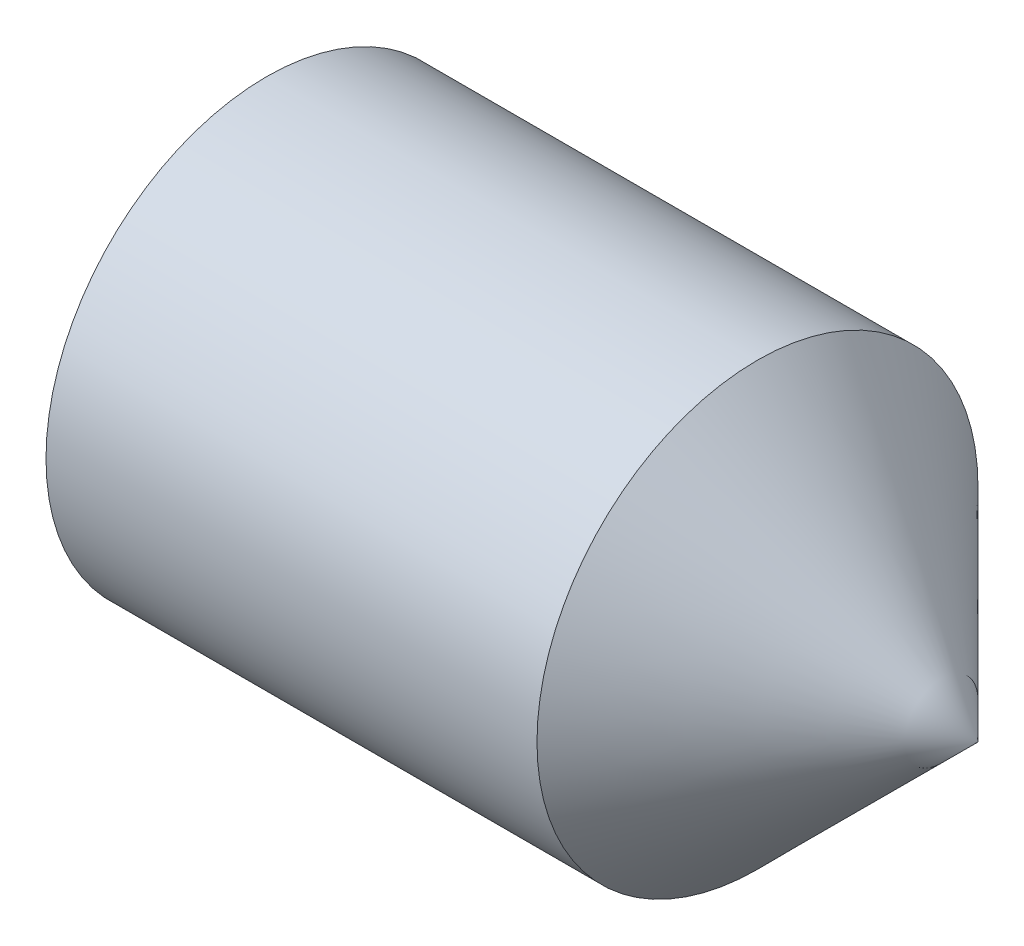
ISO-10303-21;
HEADER;
FILE_DESCRIPTION(('STEP AP214'),'2;1');
FILE_NAME('part.step','',(''),(''),'','','');
FILE_SCHEMA(('AUTOMOTIVE_DESIGN { 1 0 10303 214 1 1 1 1 }'));
ENDSEC;
DATA;
#1=APPLICATION_CONTEXT('core data for automotive mechanical design processes');
#2=APPLICATION_PROTOCOL_DEFINITION('international standard','automotive_design',2000,#1);
#3=PRODUCT_CONTEXT('',#1,'mechanical');
#4=PRODUCT('Part','Part','',(#3));
#5=PRODUCT_RELATED_PRODUCT_CATEGORY('part','',(#4));
#6=PRODUCT_DEFINITION_FORMATION('','',#4);
#7=PRODUCT_DEFINITION_CONTEXT('part definition',#1,'design');
#8=PRODUCT_DEFINITION('design','',#6,#7);
#9=PRODUCT_DEFINITION_SHAPE('','',#8);
#10=(LENGTH_UNIT() NAMED_UNIT(*) SI_UNIT(.MILLI.,.METRE.));
#11=(NAMED_UNIT(*) PLANE_ANGLE_UNIT() SI_UNIT($,.RADIAN.));
#12=(NAMED_UNIT(*) SI_UNIT($,.STERADIAN.) SOLID_ANGLE_UNIT());
#13=UNCERTAINTY_MEASURE_WITH_UNIT(LENGTH_MEASURE(1.E-05),#10,'distance_accuracy_value','');
#14=(GEOMETRIC_REPRESENTATION_CONTEXT(3) GLOBAL_UNCERTAINTY_ASSIGNED_CONTEXT((#13)) GLOBAL_UNIT_ASSIGNED_CONTEXT((#10,
#11,#12)) REPRESENTATION_CONTEXT('',''));
#15=CARTESIAN_POINT('',(0.,0.,0.));
#16=DIRECTION('',(0.,0.,1.));
#17=DIRECTION('',(1.,0.,0.));
#18=AXIS2_PLACEMENT_3D('',#15,#16,#17);
#19=CARTESIAN_POINT('',(0.,0.,0.));
#20=DIRECTION('',(-1.,0.,0.));
#21=DIRECTION('',(0.,0.,1.));
#22=AXIS2_PLACEMENT_3D('',#19,#20,#21);
#23=PLANE('',#22);
#24=CARTESIAN_POINT('',(0.,0.,0.));
#25=DIRECTION('',(-1.,0.,0.));
#26=DIRECTION('',(0.,0.,1.));
#27=AXIS2_PLACEMENT_3D('',#24,#25,#26);
#28=CIRCLE('',#27,2.4455);
#29=CARTESIAN_POINT('',(0.,0.,-2.4455));
#30=VERTEX_POINT('',#29);
#31=EDGE_CURVE('E13',#30,#30,#28,.T.);
#32=ORIENTED_EDGE('',*,*,#31,.T.);
#33=EDGE_LOOP('',(#32));
#34=FACE_BOUND('',#33,.T.);
#35=DIRECTION('',(0.,0.,-1.));
#36=VECTOR('',#35,1.);
#37=CARTESIAN_POINT('',(0.,1.50000000000003,0.866025403784415));
#38=LINE('',#37,#36);
#39=CARTESIAN_POINT('',(0.,1.50000000000003,0.866025403784415));
#40=VERTEX_POINT('',#39);
#41=CARTESIAN_POINT('',(0.,1.50000000000006,-0.866025403784471));
#42=VERTEX_POINT('',#41);
#43=EDGE_CURVE('E109',#40,#42,#38,.T.);
#44=ORIENTED_EDGE('',*,*,#43,.F.);
#45=DIRECTION('',(0.,-0.866025403784439,0.5));
#46=VECTOR('',#45,1.);
#47=CARTESIAN_POINT('',(0.,1.50000000000003,0.866025403784415));
#48=LINE('',#47,#46);
#49=CARTESIAN_POINT('',(0.,0.,1.73205080756883));
#50=VERTEX_POINT('',#49);
#51=EDGE_CURVE('E62',#40,#50,#48,.T.);
#52=ORIENTED_EDGE('',*,*,#51,.T.);
#53=DIRECTION('',(0.,0.866025403784438,0.5));
#54=VECTOR('',#53,1.);
#55=CARTESIAN_POINT('',(0.,-1.49999999999999,0.866025403784415));
#56=LINE('',#55,#54);
#57=CARTESIAN_POINT('',(0.,-1.49999999999999,0.866025403784415));
#58=VERTEX_POINT('',#57);
#59=EDGE_CURVE('E115',#58,#50,#56,.T.);
#60=ORIENTED_EDGE('',*,*,#59,.F.);
#61=DIRECTION('',(0.,0.,-1.));
#62=VECTOR('',#61,1.);
#63=CARTESIAN_POINT('',(0.,-1.49999999999999,0.866025403784415));
#64=LINE('',#63,#62);
#65=CARTESIAN_POINT('',(0.,-1.49999999999999,-0.866025403784471));
#66=VERTEX_POINT('',#65);
#67=EDGE_CURVE('E135',#58,#66,#64,.T.);
#68=ORIENTED_EDGE('',*,*,#67,.T.);
#69=DIRECTION('',(0.,0.866025403784438,-0.500000000000001));
#70=VECTOR('',#69,1.);
#71=CARTESIAN_POINT('',(0.,-1.49999999999999,-0.866025403784471));
#72=LINE('',#71,#70);
#73=CARTESIAN_POINT('',(0.,0.,-1.73205080756891));
#74=VERTEX_POINT('',#73);
#75=EDGE_CURVE('E138',#66,#74,#72,.T.);
#76=ORIENTED_EDGE('',*,*,#75,.T.);
#77=DIRECTION('',(0.,-0.866025403784438,-0.5));
#78=VECTOR('',#77,1.);
#79=CARTESIAN_POINT('',(0.,1.50000000000006,-0.866025403784471));
#80=LINE('',#79,#78);
#81=EDGE_CURVE('E141',#42,#74,#80,.T.);
#82=ORIENTED_EDGE('',*,*,#81,.F.);
#83=EDGE_LOOP('',(#44,#52,#60,#68,#76,#82));
#84=FACE_BOUND('',#83,.T.);
#85=ADVANCED_FACE('F48',(#34,#84),#23,.T.);
#86=CARTESIAN_POINT('',(0.,0.,0.));
#87=DIRECTION('',(1.,0.,0.));
#88=DIRECTION('',(0.,0.,-1.));
#89=AXIS2_PLACEMENT_3D('',#86,#87,#88);
#90=CONICAL_SURFACE('',#89,2.4455,1.0471975511966);
#91=CARTESIAN_POINT('',(0.320140724265616,0.,0.));
#92=DIRECTION('',(-1.,0.,0.));
#93=DIRECTION('',(0.,0.,1.));
#94=AXIS2_PLACEMENT_3D('',#91,#92,#93);
#95=CIRCLE('',#94,3.);
#96=CARTESIAN_POINT('',(0.320140724265616,0.,-2.99999999999995));
#97=VERTEX_POINT('',#96);
#98=EDGE_CURVE('E55',#97,#97,#95,.T.);
#99=CARTESIAN_POINT('',(0.320140724265616,0.,-2.99999999999995));
#100=CARTESIAN_POINT('',(0.316805925054516,0.,-2.99422395833328));
#101=CARTESIAN_POINT('',(0.313471125843416,0.,-2.98844791666662));
#102=CARTESIAN_POINT('',(0.306801527421215,0.,-2.97689583333328));
#103=CARTESIAN_POINT('',(0.303466728210115,0.,-2.97111979166662));
#104=CARTESIAN_POINT('',(0.296797129787915,0.,-2.95956770833329));
#105=CARTESIAN_POINT('',(0.293462330576815,0.,-2.95379166666662));
#106=CARTESIAN_POINT('',(0.286792732154614,0.,-2.94223958333329));
#107=CARTESIAN_POINT('',(0.283457932943514,0.,-2.93646354166662));
#108=CARTESIAN_POINT('',(0.276788334521314,0.,-2.92491145833329));
#109=CARTESIAN_POINT('',(0.273453535310214,0.,-2.91913541666662));
#110=CARTESIAN_POINT('',(0.266783936888013,0.,-2.90758333333329));
#111=CARTESIAN_POINT('',(0.263449137676913,0.,-2.90180729166662));
#112=CARTESIAN_POINT('',(0.256779539254713,0.,-2.89025520833329));
#113=CARTESIAN_POINT('',(0.253444740043613,0.,-2.88447916666663));
#114=CARTESIAN_POINT('',(0.246775141621412,0.,-2.87292708333329));
#115=CARTESIAN_POINT('',(0.243440342410312,0.,-2.86715104166663));
#116=CARTESIAN_POINT('',(0.236770743988112,0.,-2.8555989583333));
#117=CARTESIAN_POINT('',(0.233435944777012,0.,-2.84982291666663));
#118=CARTESIAN_POINT('',(0.226766346354811,0.,-2.8382708333333));
#119=CARTESIAN_POINT('',(0.223431547143711,0.,-2.83249479166663));
#120=CARTESIAN_POINT('',(0.216761948721511,0.,-2.8209427083333));
#121=CARTESIAN_POINT('',(0.213427149510411,0.,-2.81516666666663));
#122=CARTESIAN_POINT('',(0.20675755108821,0.,-2.8036145833333));
#123=CARTESIAN_POINT('',(0.20342275187711,0.,-2.79783854166663));
#124=CARTESIAN_POINT('',(0.19675315345491,0.,-2.7862864583333));
#125=CARTESIAN_POINT('',(0.19341835424381,0.,-2.78051041666664));
#126=CARTESIAN_POINT('',(0.186748755821609,0.,-2.7689583333333));
#127=CARTESIAN_POINT('',(0.183413956610509,0.,-2.76318229166664));
#128=CARTESIAN_POINT('',(0.176744358188309,0.,-2.7516302083333));
#129=CARTESIAN_POINT('',(0.173409558977209,0.,-2.74585416666664));
#130=CARTESIAN_POINT('',(0.166739960555008,0.,-2.73430208333331));
#131=CARTESIAN_POINT('',(0.163405161343908,0.,-2.72852604166664));
#132=CARTESIAN_POINT('',(0.156735562921708,0.,-2.71697395833331));
#133=CARTESIAN_POINT('',(0.153400763710608,0.,-2.71119791666664));
#134=CARTESIAN_POINT('',(0.146731165288407,0.,-2.69964583333331));
#135=CARTESIAN_POINT('',(0.143396366077307,0.,-2.69386979166664));
#136=CARTESIAN_POINT('',(0.136726767655107,0.,-2.68231770833331));
#137=CARTESIAN_POINT('',(0.133391968444007,0.,-2.67654166666664));
#138=CARTESIAN_POINT('',(0.126722370021806,0.,-2.66498958333331));
#139=CARTESIAN_POINT('',(0.123387570810706,0.,-2.65921354166665));
#140=CARTESIAN_POINT('',(0.116717972388506,0.,-2.64766145833331));
#141=CARTESIAN_POINT('',(0.113383173177406,0.,-2.64188541666665));
#142=CARTESIAN_POINT('',(0.106713574755205,0.,-2.63033333333332));
#143=CARTESIAN_POINT('',(0.103378775544105,0.,-2.62455729166665));
#144=CARTESIAN_POINT('',(0.0967091771219047,0.,-2.61300520833332));
#145=CARTESIAN_POINT('',(0.0933743779108045,0.,-2.60722916666665));
#146=CARTESIAN_POINT('',(0.0867047794886042,0.,-2.59567708333332));
#147=CARTESIAN_POINT('',(0.0833699802775041,0.,-2.58990104166665));
#148=CARTESIAN_POINT('',(0.0767003818553037,0.,-2.57834895833332));
#149=CARTESIAN_POINT('',(0.0733655826442035,0.,-2.57257291666665));
#150=CARTESIAN_POINT('',(0.0666959842220032,0.,-2.56102083333332));
#151=CARTESIAN_POINT('',(0.0633611850109031,0.,-2.55524479166666));
#152=CARTESIAN_POINT('',(0.0566915865887027,0.,-2.54369270833332));
#153=CARTESIAN_POINT('',(0.0533567873776026,0.,-2.53791666666666));
#154=CARTESIAN_POINT('',(0.0466871889554022,0.,-2.52636458333333));
#155=CARTESIAN_POINT('',(0.043352389744302,0.,-2.52058854166666));
#156=CARTESIAN_POINT('',(0.0366827913221017,0.,-2.50903645833333));
#157=CARTESIAN_POINT('',(0.0333479921110015,0.,-2.50326041666666));
#158=CARTESIAN_POINT('',(0.0266783936888012,0.,-2.49170833333333));
#159=CARTESIAN_POINT('',(0.023343594477701,0.,-2.48593229166666));
#160=CARTESIAN_POINT('',(0.0166739960555007,0.,-2.47438020833333));
#161=CARTESIAN_POINT('',(0.0133391968444005,0.,-2.46860416666666));
#162=CARTESIAN_POINT('',(0.00666959842220014,0.,-2.45705208333333));
#163=CARTESIAN_POINT('',(0.00333479921109996,0.,-2.45127604166667));
#164=CARTESIAN_POINT('',(0.,0.,-2.4455));
#165=B_SPLINE_CURVE_WITH_KNOTS('',3,(#99,#100,#101,#102,#103,#104,#105,#106,#107,#108,#109,#110,
#111,#112,#113,#114,#115,#116,#117,#118,#119,#120,#121,#122,#123,#124,#125,#126,#127,#128,#129,
#130,#131,#132,#133,#134,#135,#136,#137,#138,#139,#140,#141,#142,#143,#144,#145,#146,#147,#148,
#149,#150,#151,#152,#153,#154,#155,#156,#157,#158,#159,#160,#161,#162,#163,#164),.UNSPECIFIED.,
.F.,.F.,(4,2,2,2,2,2,2,2,2,2,2,2,2,2,2,2,2,2,2,2,2,2,2,2,2,2,2,2,2,2,2,2,4),(0.,
0.0200087952666013,0.0400175905332023,0.0600263857998033,0.0800351810664046,0.100043976333005,
0.120052771599606,0.140061566866207,0.160070362132808,0.180079157399409,0.200087952666011,
0.220096747932612,0.240105543199213,0.260114338465814,0.280123133732415,0.300131928999016,
0.320140724265617,0.340149519532218,0.36015831479882,0.380167110065421,0.400175905332021,
0.420184700598623,0.440193495865224,0.460202291131825,0.480211086398426,0.500219881665027,
0.520228676931628,0.540237472198229,0.56024626746483,0.580255062731432,0.600263857998033,
0.620272653264634,0.640281448531235),.UNSPECIFIED.);
#166=EDGE_CURVE('BSEAM158',#97,#30,#165,.T.);
#167=ORIENTED_EDGE('',*,*,#98,.T.);
#168=ORIENTED_EDGE('',*,*,#31,.F.);
#169=ORIENTED_EDGE('',*,*,#166,.T.);
#170=ORIENTED_EDGE('',*,*,#166,.F.);
#171=EDGE_LOOP('',(#167,#169,#168,#170));
#172=FACE_BOUND('',#171,.T.);
#173=ADVANCED_FACE('F158',(#172),#90,.T.);
#174=CARTESIAN_POINT('',(-12.7,0.,0.));
#175=DIRECTION('',(-1.,0.,0.));
#176=DIRECTION('',(0.,0.,1.));
#177=AXIS2_PLACEMENT_3D('',#174,#175,#176);
#178=CYLINDRICAL_SURFACE('',#177,3.);
#179=CARTESIAN_POINT('',(7.00000000000003,0.,0.));
#180=DIRECTION('',(-1.,0.,0.));
#181=DIRECTION('',(0.,0.,1.));
#182=AXIS2_PLACEMENT_3D('',#179,#180,#181);
#183=CIRCLE('',#182,3.);
#184=CARTESIAN_POINT('',(7.00000000000003,0.,3.));
#185=VERTEX_POINT('',#184);
#186=EDGE_CURVE('E116',#185,#185,#183,.T.);
#187=ORIENTED_EDGE('',*,*,#186,.T.);
#188=EDGE_LOOP('',(#187));
#189=FACE_BOUND('',#188,.T.);
#190=ORIENTED_EDGE('',*,*,#98,.F.);
#191=EDGE_LOOP('',(#190));
#192=FACE_BOUND('',#191,.T.);
#193=ADVANCED_FACE('F161',(#189,#192),#178,.T.);
#194=CARTESIAN_POINT('',(7.00000000000003,0.,0.));
#195=DIRECTION('',(-1.,0.,0.));
#196=DIRECTION('',(0.,0.,1.));
#197=AXIS2_PLACEMENT_3D('',#194,#195,#196);
#198=CONICAL_SURFACE('',#197,3.,0.78539816339745);
#199=CARTESIAN_POINT('',(10.,0.,0.));
#200=VERTEX_POINT('',#199);
#201=VERTEX_LOOP('',#200);
#202=FACE_BOUND('',#201,.T.);
#203=ORIENTED_EDGE('',*,*,#186,.F.);
#204=EDGE_LOOP('',(#203));
#205=FACE_BOUND('',#204,.T.);
#206=ADVANCED_FACE('F163',(#202,#205),#198,.T.);
#207=CARTESIAN_POINT('',(3.5,1.50000000000003,0.866025403784415));
#208=DIRECTION('',(0.,-0.5,-0.866025403784439));
#209=DIRECTION('',(0.,0.866025403784439,-0.5));
#210=AXIS2_PLACEMENT_3D('',#207,#208,#209);
#211=PLANE('',#210);
#212=ORIENTED_EDGE('',*,*,#51,.F.);
#213=DIRECTION('',(-1.,0.,0.));
#214=VECTOR('',#213,1.);
#215=CARTESIAN_POINT('',(3.5,1.50000000000003,0.866025403784415));
#216=LINE('',#215,#214);
#217=CARTESIAN_POINT('',(3.5,1.50000000000003,0.866025403784415));
#218=VERTEX_POINT('',#217);
#219=EDGE_CURVE('E103',#218,#40,#216,.T.);
#220=ORIENTED_EDGE('',*,*,#219,.F.);
#221=DIRECTION('',(0.,-0.866025403784439,0.5));
#222=VECTOR('',#221,1.);
#223=CARTESIAN_POINT('',(3.5,1.50000000000003,0.866025403784415));
#224=LINE('',#223,#222);
#225=CARTESIAN_POINT('',(3.5,0.,1.73205080756883));
#226=VERTEX_POINT('',#225);
#227=EDGE_CURVE('E98',#218,#226,#224,.T.);
#228=ORIENTED_EDGE('',*,*,#227,.T.);
#229=DIRECTION('',(-1.,0.,0.));
#230=VECTOR('',#229,1.);
#231=CARTESIAN_POINT('',(3.5,0.,1.73205080756883));
#232=LINE('',#231,#230);
#233=EDGE_CURVE('E101',#226,#50,#232,.T.);
#234=ORIENTED_EDGE('',*,*,#233,.T.);
#235=EDGE_LOOP('',(#212,#220,#228,#234));
#236=FACE_BOUND('',#235,.T.);
#237=ADVANCED_FACE('F100',(#236),#211,.T.);
#238=CARTESIAN_POINT('',(3.5,-1.50000000000002,0.866025403784387));
#239=DIRECTION('',(0.,-0.5,0.866025403784438));
#240=DIRECTION('',(0.,-0.866025403784438,-0.5));
#241=AXIS2_PLACEMENT_3D('',#238,#239,#240);
#242=PLANE('',#241);
#243=ORIENTED_EDGE('',*,*,#59,.T.);
#244=ORIENTED_EDGE('',*,*,#233,.F.);
#245=DIRECTION('',(0.,0.866025403784438,0.5));
#246=VECTOR('',#245,1.);
#247=CARTESIAN_POINT('',(3.5,-1.50000000000002,0.866025403784387));
#248=LINE('',#247,#246);
#249=CARTESIAN_POINT('',(3.5,-1.50000000000002,0.866025403784387));
#250=VERTEX_POINT('',#249);
#251=EDGE_CURVE('E108',#250,#226,#248,.T.);
#252=ORIENTED_EDGE('',*,*,#251,.F.);
#253=DIRECTION('',(-1.,0.,0.));
#254=VECTOR('',#253,1.);
#255=CARTESIAN_POINT('',(3.5,-1.50000000000002,0.866025403784387));
#256=LINE('',#255,#254);
#257=EDGE_CURVE('E117',#250,#58,#256,.T.);
#258=ORIENTED_EDGE('',*,*,#257,.T.);
#259=EDGE_LOOP('',(#243,#244,#252,#258));
#260=FACE_BOUND('',#259,.T.);
#261=ADVANCED_FACE('F113',(#260),#242,.F.);
#262=CARTESIAN_POINT('',(3.5,-1.50000000000002,0.866025403784387));
#263=DIRECTION('',(0.,1.,0.));
#264=DIRECTION('',(0.,0.,1.));
#265=AXIS2_PLACEMENT_3D('',#262,#263,#264);
#266=PLANE('',#265);
#267=ORIENTED_EDGE('',*,*,#67,.F.);
#268=ORIENTED_EDGE('',*,*,#257,.F.);
#269=DIRECTION('',(0.,0.,-1.));
#270=VECTOR('',#269,1.);
#271=CARTESIAN_POINT('',(3.5,-1.50000000000002,0.866025403784387));
#272=LINE('',#271,#270);
#273=CARTESIAN_POINT('',(3.49999999999998,-1.49999999999999,-0.866025403784471));
#274=VERTEX_POINT('',#273);
#275=EDGE_CURVE('E122',#250,#274,#272,.T.);
#276=ORIENTED_EDGE('',*,*,#275,.T.);
#277=DIRECTION('',(-1.,0.,0.));
#278=VECTOR('',#277,1.);
#279=CARTESIAN_POINT('',(3.49999999999998,-1.49999999999999,-0.866025403784471));
#280=LINE('',#279,#278);
#281=EDGE_CURVE('E151',#274,#66,#280,.T.);
#282=ORIENTED_EDGE('',*,*,#281,.T.);
#283=EDGE_LOOP('',(#267,#268,#276,#282));
#284=FACE_BOUND('',#283,.T.);
#285=ADVANCED_FACE('F191',(#284),#266,.T.);
#286=CARTESIAN_POINT('',(3.49999999999998,-1.49999999999999,-0.866025403784471));
#287=DIRECTION('',(0.,0.500000000000001,0.866025403784438));
#288=DIRECTION('',(0.,-0.866025403784438,0.500000000000001));
#289=AXIS2_PLACEMENT_3D('',#286,#287,#288);
#290=PLANE('',#289);
#291=ORIENTED_EDGE('',*,*,#75,.F.);
#292=ORIENTED_EDGE('',*,*,#281,.F.);
#293=DIRECTION('',(0.,0.866025403784438,-0.500000000000001));
#294=VECTOR('',#293,1.);
#295=CARTESIAN_POINT('',(3.49999999999998,-1.49999999999999,-0.866025403784471));
#296=LINE('',#295,#294);
#297=CARTESIAN_POINT('',(3.5,0.,-1.73205080756891));
#298=VERTEX_POINT('',#297);
#299=EDGE_CURVE('E124',#274,#298,#296,.T.);
#300=ORIENTED_EDGE('',*,*,#299,.T.);
#301=DIRECTION('',(-1.,0.,0.));
#302=VECTOR('',#301,1.);
#303=CARTESIAN_POINT('',(3.5,0.,-1.73205080756891));
#304=LINE('',#303,#302);
#305=EDGE_CURVE('E149',#298,#74,#304,.T.);
#306=ORIENTED_EDGE('',*,*,#305,.T.);
#307=EDGE_LOOP('',(#291,#292,#300,#306));
#308=FACE_BOUND('',#307,.T.);
#309=ADVANCED_FACE('F187',(#308),#290,.T.);
#310=CARTESIAN_POINT('',(3.50000000000003,1.50000000000004,-0.866025403784443));
#311=DIRECTION('',(0.,0.5,-0.866025403784438));
#312=DIRECTION('',(0.,0.866025403784439,0.5));
#313=AXIS2_PLACEMENT_3D('',#310,#311,#312);
#314=PLANE('',#313);
#315=ORIENTED_EDGE('',*,*,#81,.T.);
#316=ORIENTED_EDGE('',*,*,#305,.F.);
#317=DIRECTION('',(0.,-0.866025403784438,-0.5));
#318=VECTOR('',#317,1.);
#319=CARTESIAN_POINT('',(3.50000000000003,1.50000000000004,-0.866025403784443));
#320=LINE('',#319,#318);
#321=CARTESIAN_POINT('',(3.50000000000003,1.50000000000004,-0.866025403784443));
#322=VERTEX_POINT('',#321);
#323=EDGE_CURVE('E128',#322,#298,#320,.T.);
#324=ORIENTED_EDGE('',*,*,#323,.F.);
#325=DIRECTION('',(-1.,0.,0.));
#326=VECTOR('',#325,1.);
#327=CARTESIAN_POINT('',(3.50000000000003,1.50000000000004,-0.866025403784443));
#328=LINE('',#327,#326);
#329=EDGE_CURVE('E147',#322,#42,#328,.T.);
#330=ORIENTED_EDGE('',*,*,#329,.T.);
#331=EDGE_LOOP('',(#315,#316,#324,#330));
#332=FACE_BOUND('',#331,.T.);
#333=ADVANCED_FACE('F184',(#332),#314,.F.);
#334=CARTESIAN_POINT('',(3.5,1.50000000000003,0.866025403784415));
#335=DIRECTION('',(0.,1.,0.));
#336=DIRECTION('',(0.,0.,1.));
#337=AXIS2_PLACEMENT_3D('',#334,#335,#336);
#338=PLANE('',#337);
#339=ORIENTED_EDGE('',*,*,#43,.T.);
#340=ORIENTED_EDGE('',*,*,#329,.F.);
#341=DIRECTION('',(0.,0.,-1.));
#342=VECTOR('',#341,1.);
#343=CARTESIAN_POINT('',(3.5,1.50000000000003,0.866025403784415));
#344=LINE('',#343,#342);
#345=EDGE_CURVE('E131',#218,#322,#344,.T.);
#346=ORIENTED_EDGE('',*,*,#345,.F.);
#347=ORIENTED_EDGE('',*,*,#219,.T.);
#348=EDGE_LOOP('',(#339,#340,#346,#347));
#349=FACE_BOUND('',#348,.T.);
#350=ADVANCED_FACE('F180',(#349),#338,.F.);
#351=CARTESIAN_POINT('',(3.5,3.00000000000002,0.));
#352=DIRECTION('',(1.,0.,0.));
#353=DIRECTION('',(0.,0.,-1.));
#354=AXIS2_PLACEMENT_3D('',#351,#352,#353);
#355=PLANE('',#354);
#356=ORIENTED_EDGE('',*,*,#227,.F.);
#357=ORIENTED_EDGE('',*,*,#345,.T.);
#358=ORIENTED_EDGE('',*,*,#323,.T.);
#359=ORIENTED_EDGE('',*,*,#299,.F.);
#360=ORIENTED_EDGE('',*,*,#275,.F.);
#361=ORIENTED_EDGE('',*,*,#251,.T.);
#362=EDGE_LOOP('',(#356,#357,#358,#359,#360,#361));
#363=FACE_BOUND('',#362,.T.);
#364=ADVANCED_FACE('F120',(#363),#355,.F.);
#365=CLOSED_SHELL('',(#85,#173,#193,#206,#237,#261,#285,#309,#333,#350,#364));
#366=MANIFOLD_SOLID_BREP('B2',#365);
#367=ADVANCED_BREP_SHAPE_REPRESENTATION('',(#18,#366),#14);
#368=SHAPE_DEFINITION_REPRESENTATION(#9,#367);
ENDSEC;
END-ISO-10303-21;
